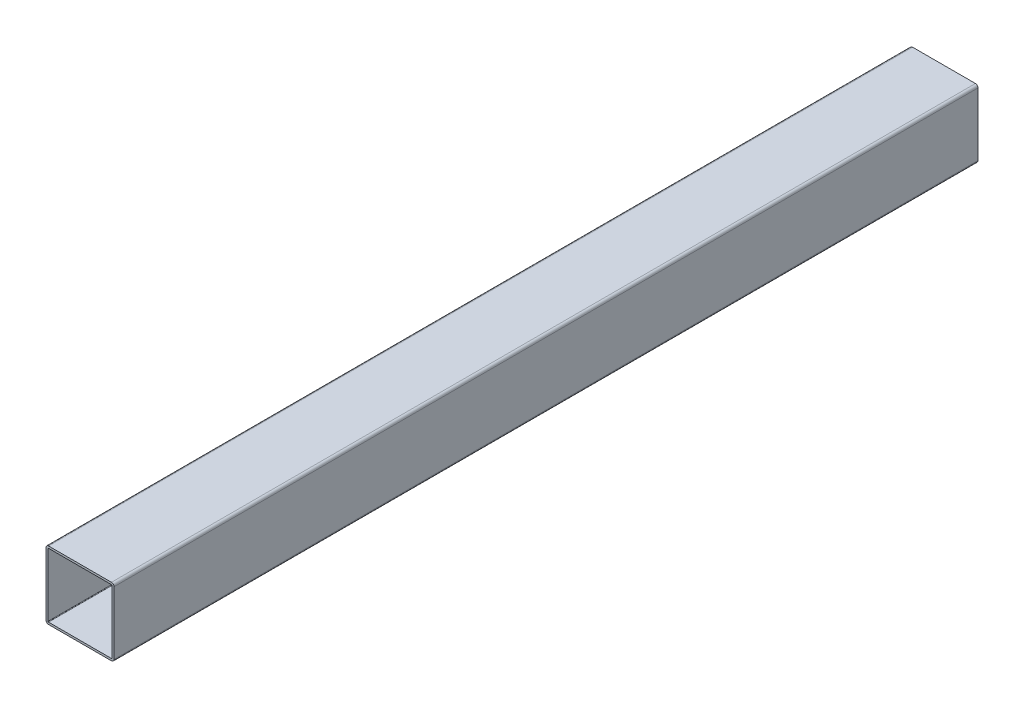
ISO-10303-21;
HEADER;
FILE_DESCRIPTION(('STEP AP214'),'2;1');
FILE_NAME('part.step','',(''),(''),'','','');
FILE_SCHEMA(('AUTOMOTIVE_DESIGN { 1 0 10303 214 1 1 1 1 }'));
ENDSEC;
DATA;
#1=APPLICATION_CONTEXT('core data for automotive mechanical design processes');
#2=APPLICATION_PROTOCOL_DEFINITION('international standard','automotive_design',2000,#1);
#3=PRODUCT_CONTEXT('',#1,'mechanical');
#4=PRODUCT('Part','Part','',(#3));
#5=PRODUCT_RELATED_PRODUCT_CATEGORY('part','',(#4));
#6=PRODUCT_DEFINITION_FORMATION('','',#4);
#7=PRODUCT_DEFINITION_CONTEXT('part definition',#1,'design');
#8=PRODUCT_DEFINITION('design','',#6,#7);
#9=PRODUCT_DEFINITION_SHAPE('','',#8);
#10=(LENGTH_UNIT() NAMED_UNIT(*) SI_UNIT(.MILLI.,.METRE.));
#11=(NAMED_UNIT(*) PLANE_ANGLE_UNIT() SI_UNIT($,.RADIAN.));
#12=(NAMED_UNIT(*) SI_UNIT($,.STERADIAN.) SOLID_ANGLE_UNIT());
#13=UNCERTAINTY_MEASURE_WITH_UNIT(LENGTH_MEASURE(1.E-05),#10,'distance_accuracy_value','');
#14=(GEOMETRIC_REPRESENTATION_CONTEXT(3) GLOBAL_UNCERTAINTY_ASSIGNED_CONTEXT((#13)) GLOBAL_UNIT_ASSIGNED_CONTEXT((#10,
#11,#12)) REPRESENTATION_CONTEXT('',''));
#15=CARTESIAN_POINT('',(0.,0.,0.));
#16=DIRECTION('',(0.,0.,1.));
#17=DIRECTION('',(1.,0.,0.));
#18=AXIS2_PLACEMENT_3D('',#15,#16,#17);
#19=CARTESIAN_POINT('',(-18.5,18.5,-508.));
#20=DIRECTION('',(0.,0.,1.));
#21=DIRECTION('',(1.,0.,0.));
#22=AXIS2_PLACEMENT_3D('',#19,#20,#21);
#23=CYLINDRICAL_SURFACE('',#22,1.5);
#24=CARTESIAN_POINT('',(-18.5,18.5,0.));
#25=DIRECTION('',(0.,0.,-1.));
#26=DIRECTION('',(-1.,0.,0.));
#27=AXIS2_PLACEMENT_3D('',#24,#25,#26);
#28=CIRCLE('',#27,1.5);
#29=CARTESIAN_POINT('',(-20.,18.5,0.));
#30=VERTEX_POINT('',#29);
#31=CARTESIAN_POINT('',(-18.5,20.,0.));
#32=VERTEX_POINT('',#31);
#33=EDGE_CURVE('E233',#30,#32,#28,.T.);
#34=ORIENTED_EDGE('',*,*,#33,.T.);
#35=DIRECTION('',(0.,0.,1.));
#36=VECTOR('',#35,1.);
#37=CARTESIAN_POINT('',(-18.5,20.,-508.));
#38=LINE('',#37,#36);
#39=CARTESIAN_POINT('',(-18.5,20.,-508.));
#40=VERTEX_POINT('',#39);
#41=EDGE_CURVE('E12',#40,#32,#38,.T.);
#42=ORIENTED_EDGE('',*,*,#41,.F.);
#43=CARTESIAN_POINT('',(-18.5,18.5,-508.));
#44=DIRECTION('',(0.,0.,-1.));
#45=DIRECTION('',(-1.,0.,0.));
#46=AXIS2_PLACEMENT_3D('',#43,#44,#45);
#47=CIRCLE('',#46,1.5);
#48=CARTESIAN_POINT('',(-20.,18.5,-508.));
#49=VERTEX_POINT('',#48);
#50=EDGE_CURVE('E311',#49,#40,#47,.T.);
#51=ORIENTED_EDGE('',*,*,#50,.F.);
#52=DIRECTION('',(0.,0.,1.));
#53=VECTOR('',#52,1.);
#54=CARTESIAN_POINT('',(-20.,18.5,-508.));
#55=LINE('',#54,#53);
#56=EDGE_CURVE('E248',#49,#30,#55,.T.);
#57=ORIENTED_EDGE('',*,*,#56,.T.);
#58=EDGE_LOOP('',(#34,#42,#51,#57));
#59=FACE_BOUND('',#58,.T.);
#60=ADVANCED_FACE('F61',(#59),#23,.T.);
#61=CARTESIAN_POINT('',(-18.5,20.,-508.));
#62=DIRECTION('',(0.,-1.,0.));
#63=DIRECTION('',(0.,0.,-1.));
#64=AXIS2_PLACEMENT_3D('',#61,#62,#63);
#65=PLANE('',#64);
#66=DIRECTION('',(1.,0.,0.));
#67=VECTOR('',#66,1.);
#68=CARTESIAN_POINT('',(-18.5,20.,0.));
#69=LINE('',#68,#67);
#70=CARTESIAN_POINT('',(18.5,20.,0.));
#71=VERTEX_POINT('',#70);
#72=EDGE_CURVE('E236',#32,#71,#69,.T.);
#73=ORIENTED_EDGE('',*,*,#72,.T.);
#74=DIRECTION('',(0.,0.,1.));
#75=VECTOR('',#74,1.);
#76=CARTESIAN_POINT('',(18.5,20.,-508.));
#77=LINE('',#76,#75);
#78=CARTESIAN_POINT('',(18.5,20.,-508.));
#79=VERTEX_POINT('',#78);
#80=EDGE_CURVE('E71',#79,#71,#77,.T.);
#81=ORIENTED_EDGE('',*,*,#80,.F.);
#82=DIRECTION('',(1.,0.,0.));
#83=VECTOR('',#82,1.);
#84=CARTESIAN_POINT('',(-18.5,20.,-508.));
#85=LINE('',#84,#83);
#86=EDGE_CURVE('E313',#40,#79,#85,.T.);
#87=ORIENTED_EDGE('',*,*,#86,.F.);
#88=ORIENTED_EDGE('',*,*,#41,.T.);
#89=EDGE_LOOP('',(#73,#81,#87,#88));
#90=FACE_BOUND('',#89,.T.);
#91=ADVANCED_FACE('F348',(#90),#65,.F.);
#92=CARTESIAN_POINT('',(18.5,18.5,-508.));
#93=DIRECTION('',(0.,0.,1.));
#94=DIRECTION('',(1.,0.,0.));
#95=AXIS2_PLACEMENT_3D('',#92,#93,#94);
#96=CYLINDRICAL_SURFACE('',#95,1.5);
#97=CARTESIAN_POINT('',(18.5,18.5,0.));
#98=DIRECTION('',(0.,0.,-1.));
#99=DIRECTION('',(-1.,0.,0.));
#100=AXIS2_PLACEMENT_3D('',#97,#98,#99);
#101=CIRCLE('',#100,1.5);
#102=CARTESIAN_POINT('',(20.,18.5,0.));
#103=VERTEX_POINT('',#102);
#104=EDGE_CURVE('E238',#71,#103,#101,.T.);
#105=ORIENTED_EDGE('',*,*,#104,.T.);
#106=DIRECTION('',(0.,0.,1.));
#107=VECTOR('',#106,1.);
#108=CARTESIAN_POINT('',(20.,18.5,-508.));
#109=LINE('',#108,#107);
#110=CARTESIAN_POINT('',(20.,18.5,-508.));
#111=VERTEX_POINT('',#110);
#112=EDGE_CURVE('E255',#111,#103,#109,.T.);
#113=ORIENTED_EDGE('',*,*,#112,.F.);
#114=CARTESIAN_POINT('',(18.5,18.5,-508.));
#115=DIRECTION('',(0.,0.,-1.));
#116=DIRECTION('',(-1.,0.,0.));
#117=AXIS2_PLACEMENT_3D('',#114,#115,#116);
#118=CIRCLE('',#117,1.5);
#119=EDGE_CURVE('E315',#79,#111,#118,.T.);
#120=ORIENTED_EDGE('',*,*,#119,.F.);
#121=ORIENTED_EDGE('',*,*,#80,.T.);
#122=EDGE_LOOP('',(#105,#113,#120,#121));
#123=FACE_BOUND('',#122,.T.);
#124=ADVANCED_FACE('F353',(#123),#96,.T.);
#125=CARTESIAN_POINT('',(20.,-18.5,-508.));
#126=DIRECTION('',(-1.,0.,0.));
#127=DIRECTION('',(0.,0.,1.));
#128=AXIS2_PLACEMENT_3D('',#125,#126,#127);
#129=PLANE('',#128);
#130=DIRECTION('',(0.,-1.,0.));
#131=VECTOR('',#130,1.);
#132=CARTESIAN_POINT('',(20.,-18.5,0.));
#133=LINE('',#132,#131);
#134=CARTESIAN_POINT('',(20.,-18.5,0.));
#135=VERTEX_POINT('',#134);
#136=EDGE_CURVE('E240',#103,#135,#133,.T.);
#137=ORIENTED_EDGE('',*,*,#136,.T.);
#138=DIRECTION('',(0.,0.,1.));
#139=VECTOR('',#138,1.);
#140=CARTESIAN_POINT('',(20.,-18.5,-508.));
#141=LINE('',#140,#139);
#142=CARTESIAN_POINT('',(20.,-18.5,-508.));
#143=VERTEX_POINT('',#142);
#144=EDGE_CURVE('E252',#143,#135,#141,.T.);
#145=ORIENTED_EDGE('',*,*,#144,.F.);
#146=DIRECTION('',(0.,-1.,0.));
#147=VECTOR('',#146,1.);
#148=CARTESIAN_POINT('',(20.,-18.5,-508.));
#149=LINE('',#148,#147);
#150=EDGE_CURVE('E317',#111,#143,#149,.T.);
#151=ORIENTED_EDGE('',*,*,#150,.F.);
#152=ORIENTED_EDGE('',*,*,#112,.T.);
#153=EDGE_LOOP('',(#137,#145,#151,#152));
#154=FACE_BOUND('',#153,.T.);
#155=ADVANCED_FACE('F323',(#154),#129,.F.);
#156=CARTESIAN_POINT('',(18.5,-18.5,-508.));
#157=DIRECTION('',(0.,0.,1.));
#158=DIRECTION('',(1.,0.,0.));
#159=AXIS2_PLACEMENT_3D('',#156,#157,#158);
#160=CYLINDRICAL_SURFACE('',#159,1.5);
#161=CARTESIAN_POINT('',(18.5,-18.5,0.));
#162=DIRECTION('',(0.,0.,-1.));
#163=DIRECTION('',(-1.,0.,0.));
#164=AXIS2_PLACEMENT_3D('',#161,#162,#163);
#165=CIRCLE('',#164,1.5);
#166=CARTESIAN_POINT('',(18.5,-20.,0.));
#167=VERTEX_POINT('',#166);
#168=EDGE_CURVE('E242',#135,#167,#165,.T.);
#169=ORIENTED_EDGE('',*,*,#168,.T.);
#170=DIRECTION('',(0.,0.,1.));
#171=VECTOR('',#170,1.);
#172=CARTESIAN_POINT('',(18.5,-20.,-508.));
#173=LINE('',#172,#171);
#174=CARTESIAN_POINT('',(18.5,-20.,-508.));
#175=VERTEX_POINT('',#174);
#176=EDGE_CURVE('E200',#175,#167,#173,.T.);
#177=ORIENTED_EDGE('',*,*,#176,.F.);
#178=CARTESIAN_POINT('',(18.5,-18.5,-508.));
#179=DIRECTION('',(0.,0.,-1.));
#180=DIRECTION('',(-1.,0.,0.));
#181=AXIS2_PLACEMENT_3D('',#178,#179,#180);
#182=CIRCLE('',#181,1.5);
#183=EDGE_CURVE('E191',#143,#175,#182,.T.);
#184=ORIENTED_EDGE('',*,*,#183,.F.);
#185=ORIENTED_EDGE('',*,*,#144,.T.);
#186=EDGE_LOOP('',(#169,#177,#184,#185));
#187=FACE_BOUND('',#186,.T.);
#188=ADVANCED_FACE('F327',(#187),#160,.T.);
#189=CARTESIAN_POINT('',(18.5,-20.,-508.));
#190=DIRECTION('',(0.,1.,0.));
#191=DIRECTION('',(0.,0.,1.));
#192=AXIS2_PLACEMENT_3D('',#189,#190,#191);
#193=PLANE('',#192);
#194=DIRECTION('',(-1.,0.,0.));
#195=VECTOR('',#194,1.);
#196=CARTESIAN_POINT('',(18.5,-20.,0.));
#197=LINE('',#196,#195);
#198=CARTESIAN_POINT('',(-18.5,-20.,0.));
#199=VERTEX_POINT('',#198);
#200=EDGE_CURVE('E199',#167,#199,#197,.T.);
#201=ORIENTED_EDGE('',*,*,#200,.T.);
#202=DIRECTION('',(0.,0.,1.));
#203=VECTOR('',#202,1.);
#204=CARTESIAN_POINT('',(-18.5,-20.,-508.));
#205=LINE('',#204,#203);
#206=CARTESIAN_POINT('',(-18.5,-20.,-508.));
#207=VERTEX_POINT('',#206);
#208=EDGE_CURVE('E196',#207,#199,#205,.T.);
#209=ORIENTED_EDGE('',*,*,#208,.F.);
#210=DIRECTION('',(-1.,0.,0.));
#211=VECTOR('',#210,1.);
#212=CARTESIAN_POINT('',(18.5,-20.,-508.));
#213=LINE('',#212,#211);
#214=EDGE_CURVE('E185',#175,#207,#213,.T.);
#215=ORIENTED_EDGE('',*,*,#214,.F.);
#216=ORIENTED_EDGE('',*,*,#176,.T.);
#217=EDGE_LOOP('',(#201,#209,#215,#216));
#218=FACE_BOUND('',#217,.T.);
#219=ADVANCED_FACE('F197',(#218),#193,.F.);
#220=CARTESIAN_POINT('',(-18.5,-18.5,-508.));
#221=DIRECTION('',(0.,0.,1.));
#222=DIRECTION('',(1.,0.,0.));
#223=AXIS2_PLACEMENT_3D('',#220,#221,#222);
#224=CYLINDRICAL_SURFACE('',#223,1.5);
#225=CARTESIAN_POINT('',(-18.5,-18.5,0.));
#226=DIRECTION('',(0.,0.,-1.));
#227=DIRECTION('',(-1.,0.,0.));
#228=AXIS2_PLACEMENT_3D('',#225,#226,#227);
#229=CIRCLE('',#228,1.5);
#230=CARTESIAN_POINT('',(-20.,-18.5,0.));
#231=VERTEX_POINT('',#230);
#232=EDGE_CURVE('E133',#199,#231,#229,.T.);
#233=ORIENTED_EDGE('',*,*,#232,.T.);
#234=DIRECTION('',(0.,0.,1.));
#235=VECTOR('',#234,1.);
#236=CARTESIAN_POINT('',(-20.,-18.5,-508.));
#237=LINE('',#236,#235);
#238=CARTESIAN_POINT('',(-20.,-18.5,-508.));
#239=VERTEX_POINT('',#238);
#240=EDGE_CURVE('E201',#239,#231,#237,.T.);
#241=ORIENTED_EDGE('',*,*,#240,.F.);
#242=CARTESIAN_POINT('',(-18.5,-18.5,-508.));
#243=DIRECTION('',(0.,0.,-1.));
#244=DIRECTION('',(-1.,0.,0.));
#245=AXIS2_PLACEMENT_3D('',#242,#243,#244);
#246=CIRCLE('',#245,1.5);
#247=EDGE_CURVE('E189',#207,#239,#246,.T.);
#248=ORIENTED_EDGE('',*,*,#247,.F.);
#249=ORIENTED_EDGE('',*,*,#208,.T.);
#250=EDGE_LOOP('',(#233,#241,#248,#249));
#251=FACE_BOUND('',#250,.T.);
#252=ADVANCED_FACE('F203',(#251),#224,.T.);
#253=CARTESIAN_POINT('',(18.5,18.5,-508.));
#254=DIRECTION('',(0.,0.,1.));
#255=DIRECTION('',(1.,0.,0.));
#256=AXIS2_PLACEMENT_3D('',#253,#254,#255);
#257=CYLINDRICAL_SURFACE('',#256,0.3);
#258=CARTESIAN_POINT('',(18.5,18.5,0.));
#259=DIRECTION('',(0.,0.,-1.));
#260=DIRECTION('',(-1.,0.,0.));
#261=AXIS2_PLACEMENT_3D('',#258,#259,#260);
#262=CIRCLE('',#261,0.3);
#263=CARTESIAN_POINT('',(18.5,18.8,0.));
#264=VERTEX_POINT('',#263);
#265=CARTESIAN_POINT('',(18.8,18.5,0.));
#266=VERTEX_POINT('',#265);
#267=EDGE_CURVE('E209',#264,#266,#262,.T.);
#268=ORIENTED_EDGE('',*,*,#267,.F.);
#269=DIRECTION('',(0.,0.,1.));
#270=VECTOR('',#269,1.);
#271=CARTESIAN_POINT('',(18.5,18.8,-508.));
#272=LINE('',#271,#270);
#273=CARTESIAN_POINT('',(18.5,18.8,-508.));
#274=VERTEX_POINT('',#273);
#275=EDGE_CURVE('E65',#274,#264,#272,.T.);
#276=ORIENTED_EDGE('',*,*,#275,.F.);
#277=CARTESIAN_POINT('',(18.5,18.5,-508.));
#278=DIRECTION('',(0.,0.,-1.));
#279=DIRECTION('',(-1.,0.,0.));
#280=AXIS2_PLACEMENT_3D('',#277,#278,#279);
#281=CIRCLE('',#280,0.3);
#282=CARTESIAN_POINT('',(18.8,18.5,-508.));
#283=VERTEX_POINT('',#282);
#284=EDGE_CURVE('E247',#274,#283,#281,.T.);
#285=ORIENTED_EDGE('',*,*,#284,.T.);
#286=DIRECTION('',(0.,0.,1.));
#287=VECTOR('',#286,1.);
#288=CARTESIAN_POINT('',(18.8,18.5,-508.));
#289=LINE('',#288,#287);
#290=EDGE_CURVE('E205',#283,#266,#289,.T.);
#291=ORIENTED_EDGE('',*,*,#290,.T.);
#292=EDGE_LOOP('',(#268,#276,#285,#291));
#293=FACE_BOUND('',#292,.T.);
#294=ADVANCED_FACE('F63',(#293),#257,.F.);
#295=CARTESIAN_POINT('',(-18.5,18.8,-508.));
#296=DIRECTION('',(0.,-1.,0.));
#297=DIRECTION('',(0.,0.,-1.));
#298=AXIS2_PLACEMENT_3D('',#295,#296,#297);
#299=PLANE('',#298);
#300=DIRECTION('',(1.,0.,0.));
#301=VECTOR('',#300,1.);
#302=CARTESIAN_POINT('',(-18.5,18.8,0.));
#303=LINE('',#302,#301);
#304=CARTESIAN_POINT('',(-18.5,18.8,0.));
#305=VERTEX_POINT('',#304);
#306=EDGE_CURVE('E212',#305,#264,#303,.T.);
#307=ORIENTED_EDGE('',*,*,#306,.F.);
#308=DIRECTION('',(0.,0.,1.));
#309=VECTOR('',#308,1.);
#310=CARTESIAN_POINT('',(-18.5,18.8,-508.));
#311=LINE('',#310,#309);
#312=CARTESIAN_POINT('',(-18.5,18.8,-508.));
#313=VERTEX_POINT('',#312);
#314=EDGE_CURVE('E270',#313,#305,#311,.T.);
#315=ORIENTED_EDGE('',*,*,#314,.F.);
#316=DIRECTION('',(1.,0.,0.));
#317=VECTOR('',#316,1.);
#318=CARTESIAN_POINT('',(-18.5,18.8,-508.));
#319=LINE('',#318,#317);
#320=EDGE_CURVE('E279',#313,#274,#319,.T.);
#321=ORIENTED_EDGE('',*,*,#320,.T.);
#322=ORIENTED_EDGE('',*,*,#275,.T.);
#323=EDGE_LOOP('',(#307,#315,#321,#322));
#324=FACE_BOUND('',#323,.T.);
#325=ADVANCED_FACE('F277',(#324),#299,.T.);
#326=CARTESIAN_POINT('',(-18.5,18.5,-508.));
#327=DIRECTION('',(0.,0.,1.));
#328=DIRECTION('',(1.,0.,0.));
#329=AXIS2_PLACEMENT_3D('',#326,#327,#328);
#330=CYLINDRICAL_SURFACE('',#329,0.3);
#331=CARTESIAN_POINT('',(-18.5,18.5,0.));
#332=DIRECTION('',(0.,0.,-1.));
#333=DIRECTION('',(-1.,0.,0.));
#334=AXIS2_PLACEMENT_3D('',#331,#332,#333);
#335=CIRCLE('',#334,0.3);
#336=CARTESIAN_POINT('',(-18.8,18.5,0.));
#337=VERTEX_POINT('',#336);
#338=EDGE_CURVE('E215',#337,#305,#335,.T.);
#339=ORIENTED_EDGE('',*,*,#338,.F.);
#340=DIRECTION('',(0.,0.,1.));
#341=VECTOR('',#340,1.);
#342=CARTESIAN_POINT('',(-18.8,18.5,-508.));
#343=LINE('',#342,#341);
#344=CARTESIAN_POINT('',(-18.8,18.5,-508.));
#345=VERTEX_POINT('',#344);
#346=EDGE_CURVE('E269',#345,#337,#343,.T.);
#347=ORIENTED_EDGE('',*,*,#346,.F.);
#348=CARTESIAN_POINT('',(-18.5,18.5,-508.));
#349=DIRECTION('',(0.,0.,-1.));
#350=DIRECTION('',(-1.,0.,0.));
#351=AXIS2_PLACEMENT_3D('',#348,#349,#350);
#352=CIRCLE('',#351,0.3);
#353=EDGE_CURVE('E287',#345,#313,#352,.T.);
#354=ORIENTED_EDGE('',*,*,#353,.T.);
#355=ORIENTED_EDGE('',*,*,#314,.T.);
#356=EDGE_LOOP('',(#339,#347,#354,#355));
#357=FACE_BOUND('',#356,.T.);
#358=ADVANCED_FACE('F285',(#357),#330,.F.);
#359=CARTESIAN_POINT('',(-18.8,18.5,-508.));
#360=DIRECTION('',(1.,0.,0.));
#361=DIRECTION('',(0.,0.,-1.));
#362=AXIS2_PLACEMENT_3D('',#359,#360,#361);
#363=PLANE('',#362);
#364=DIRECTION('',(0.,1.,0.));
#365=VECTOR('',#364,1.);
#366=CARTESIAN_POINT('',(-18.8,18.5,0.));
#367=LINE('',#366,#365);
#368=CARTESIAN_POINT('',(-18.8,-18.5,0.));
#369=VERTEX_POINT('',#368);
#370=EDGE_CURVE('E218',#369,#337,#367,.T.);
#371=ORIENTED_EDGE('',*,*,#370,.F.);
#372=DIRECTION('',(0.,0.,1.));
#373=VECTOR('',#372,1.);
#374=CARTESIAN_POINT('',(-18.8,-18.5,-508.));
#375=LINE('',#374,#373);
#376=CARTESIAN_POINT('',(-18.8,-18.5,-508.));
#377=VERTEX_POINT('',#376);
#378=EDGE_CURVE('E267',#377,#369,#375,.T.);
#379=ORIENTED_EDGE('',*,*,#378,.F.);
#380=DIRECTION('',(0.,1.,0.));
#381=VECTOR('',#380,1.);
#382=CARTESIAN_POINT('',(-18.8,18.5,-508.));
#383=LINE('',#382,#381);
#384=EDGE_CURVE('E293',#377,#345,#383,.T.);
#385=ORIENTED_EDGE('',*,*,#384,.T.);
#386=ORIENTED_EDGE('',*,*,#346,.T.);
#387=EDGE_LOOP('',(#371,#379,#385,#386));
#388=FACE_BOUND('',#387,.T.);
#389=ADVANCED_FACE('F296',(#388),#363,.T.);
#390=CARTESIAN_POINT('',(-18.5,-18.5,-508.));
#391=DIRECTION('',(0.,0.,1.));
#392=DIRECTION('',(1.,0.,0.));
#393=AXIS2_PLACEMENT_3D('',#390,#391,#392);
#394=CYLINDRICAL_SURFACE('',#393,0.300000000000005);
#395=CARTESIAN_POINT('',(-18.5,-18.5,0.));
#396=DIRECTION('',(0.,0.,-1.));
#397=DIRECTION('',(-1.,0.,0.));
#398=AXIS2_PLACEMENT_3D('',#395,#396,#397);
#399=CIRCLE('',#398,0.300000000000005);
#400=CARTESIAN_POINT('',(-18.5,-18.8,0.));
#401=VERTEX_POINT('',#400);
#402=EDGE_CURVE('E221',#401,#369,#399,.T.);
#403=ORIENTED_EDGE('',*,*,#402,.F.);
#404=DIRECTION('',(0.,0.,1.));
#405=VECTOR('',#404,1.);
#406=CARTESIAN_POINT('',(-18.5,-18.8,-508.));
#407=LINE('',#406,#405);
#408=CARTESIAN_POINT('',(-18.5,-18.8,-508.));
#409=VERTEX_POINT('',#408);
#410=EDGE_CURVE('E265',#409,#401,#407,.T.);
#411=ORIENTED_EDGE('',*,*,#410,.F.);
#412=CARTESIAN_POINT('',(-18.5,-18.5,-508.));
#413=DIRECTION('',(0.,0.,-1.));
#414=DIRECTION('',(-1.,0.,0.));
#415=AXIS2_PLACEMENT_3D('',#412,#413,#414);
#416=CIRCLE('',#415,0.300000000000005);
#417=EDGE_CURVE('E297',#409,#377,#416,.T.);
#418=ORIENTED_EDGE('',*,*,#417,.T.);
#419=ORIENTED_EDGE('',*,*,#378,.T.);
#420=EDGE_LOOP('',(#403,#411,#418,#419));
#421=FACE_BOUND('',#420,.T.);
#422=ADVANCED_FACE('F364',(#421),#394,.F.);
#423=CARTESIAN_POINT('',(18.5,-18.8,-508.));
#424=DIRECTION('',(0.,1.,0.));
#425=DIRECTION('',(0.,0.,1.));
#426=AXIS2_PLACEMENT_3D('',#423,#424,#425);
#427=PLANE('',#426);
#428=DIRECTION('',(-1.,0.,0.));
#429=VECTOR('',#428,1.);
#430=CARTESIAN_POINT('',(18.5,-18.8,0.));
#431=LINE('',#430,#429);
#432=CARTESIAN_POINT('',(18.5,-18.8,0.));
#433=VERTEX_POINT('',#432);
#434=EDGE_CURVE('E224',#433,#401,#431,.T.);
#435=ORIENTED_EDGE('',*,*,#434,.F.);
#436=DIRECTION('',(0.,0.,1.));
#437=VECTOR('',#436,1.);
#438=CARTESIAN_POINT('',(18.5,-18.8,-508.));
#439=LINE('',#438,#437);
#440=CARTESIAN_POINT('',(18.5,-18.8,-508.));
#441=VERTEX_POINT('',#440);
#442=EDGE_CURVE('E263',#441,#433,#439,.T.);
#443=ORIENTED_EDGE('',*,*,#442,.F.);
#444=DIRECTION('',(-1.,0.,0.));
#445=VECTOR('',#444,1.);
#446=CARTESIAN_POINT('',(18.5,-18.8,-508.));
#447=LINE('',#446,#445);
#448=EDGE_CURVE('E299',#441,#409,#447,.T.);
#449=ORIENTED_EDGE('',*,*,#448,.T.);
#450=ORIENTED_EDGE('',*,*,#410,.T.);
#451=EDGE_LOOP('',(#435,#443,#449,#450));
#452=FACE_BOUND('',#451,.T.);
#453=ADVANCED_FACE('F360',(#452),#427,.T.);
#454=CARTESIAN_POINT('',(18.5,-18.5,-508.));
#455=DIRECTION('',(0.,0.,1.));
#456=DIRECTION('',(1.,0.,0.));
#457=AXIS2_PLACEMENT_3D('',#454,#455,#456);
#458=CYLINDRICAL_SURFACE('',#457,0.300000000000003);
#459=CARTESIAN_POINT('',(18.5,-18.5,0.));
#460=DIRECTION('',(0.,0.,-1.));
#461=DIRECTION('',(-1.,0.,0.));
#462=AXIS2_PLACEMENT_3D('',#459,#460,#461);
#463=CIRCLE('',#462,0.300000000000003);
#464=CARTESIAN_POINT('',(18.8,-18.5,0.));
#465=VERTEX_POINT('',#464);
#466=EDGE_CURVE('E227',#465,#433,#463,.T.);
#467=ORIENTED_EDGE('',*,*,#466,.F.);
#468=DIRECTION('',(0.,0.,1.));
#469=VECTOR('',#468,1.);
#470=CARTESIAN_POINT('',(18.8,-18.5,-508.));
#471=LINE('',#470,#469);
#472=CARTESIAN_POINT('',(18.8,-18.5,-508.));
#473=VERTEX_POINT('',#472);
#474=EDGE_CURVE('E261',#473,#465,#471,.T.);
#475=ORIENTED_EDGE('',*,*,#474,.F.);
#476=CARTESIAN_POINT('',(18.5,-18.5,-508.));
#477=DIRECTION('',(0.,0.,-1.));
#478=DIRECTION('',(-1.,0.,0.));
#479=AXIS2_PLACEMENT_3D('',#476,#477,#478);
#480=CIRCLE('',#479,0.300000000000003);
#481=EDGE_CURVE('E305',#473,#441,#480,.T.);
#482=ORIENTED_EDGE('',*,*,#481,.T.);
#483=ORIENTED_EDGE('',*,*,#442,.T.);
#484=EDGE_LOOP('',(#467,#475,#482,#483));
#485=FACE_BOUND('',#484,.T.);
#486=ADVANCED_FACE('F342',(#485),#458,.F.);
#487=CARTESIAN_POINT('',(18.8,-18.5,-508.));
#488=DIRECTION('',(-1.,0.,0.));
#489=DIRECTION('',(0.,0.,1.));
#490=AXIS2_PLACEMENT_3D('',#487,#488,#489);
#491=PLANE('',#490);
#492=DIRECTION('',(0.,-1.,0.));
#493=VECTOR('',#492,1.);
#494=CARTESIAN_POINT('',(18.8,-18.5,0.));
#495=LINE('',#494,#493);
#496=EDGE_CURVE('E230',#266,#465,#495,.T.);
#497=ORIENTED_EDGE('',*,*,#496,.F.);
#498=ORIENTED_EDGE('',*,*,#290,.F.);
#499=DIRECTION('',(0.,-1.,0.));
#500=VECTOR('',#499,1.);
#501=CARTESIAN_POINT('',(18.8,-18.5,-508.));
#502=LINE('',#501,#500);
#503=EDGE_CURVE('E308',#283,#473,#502,.T.);
#504=ORIENTED_EDGE('',*,*,#503,.T.);
#505=ORIENTED_EDGE('',*,*,#474,.T.);
#506=EDGE_LOOP('',(#497,#498,#504,#505));
#507=FACE_BOUND('',#506,.T.);
#508=ADVANCED_FACE('F335',(#507),#491,.T.);
#509=CARTESIAN_POINT('',(-20.,18.5,-508.));
#510=DIRECTION('',(1.,0.,0.));
#511=DIRECTION('',(0.,0.,-1.));
#512=AXIS2_PLACEMENT_3D('',#509,#510,#511);
#513=PLANE('',#512);
#514=DIRECTION('',(0.,1.,0.));
#515=VECTOR('',#514,1.);
#516=CARTESIAN_POINT('',(-20.,18.5,0.));
#517=LINE('',#516,#515);
#518=EDGE_CURVE('E139',#231,#30,#517,.T.);
#519=ORIENTED_EDGE('',*,*,#518,.T.);
#520=ORIENTED_EDGE('',*,*,#56,.F.);
#521=DIRECTION('',(0.,1.,0.));
#522=VECTOR('',#521,1.);
#523=CARTESIAN_POINT('',(-20.,18.5,-508.));
#524=LINE('',#523,#522);
#525=EDGE_CURVE('E80',#239,#49,#524,.T.);
#526=ORIENTED_EDGE('',*,*,#525,.F.);
#527=ORIENTED_EDGE('',*,*,#240,.T.);
#528=EDGE_LOOP('',(#519,#520,#526,#527));
#529=FACE_BOUND('',#528,.T.);
#530=ADVANCED_FACE('F333',(#529),#513,.F.);
#531=CARTESIAN_POINT('',(-18.5,18.5,-508.));
#532=DIRECTION('',(0.,0.,-1.));
#533=DIRECTION('',(-1.,0.,0.));
#534=AXIS2_PLACEMENT_3D('',#531,#532,#533);
#535=PLANE('',#534);
#536=ORIENTED_EDGE('',*,*,#284,.F.);
#537=ORIENTED_EDGE('',*,*,#320,.F.);
#538=ORIENTED_EDGE('',*,*,#353,.F.);
#539=ORIENTED_EDGE('',*,*,#384,.F.);
#540=ORIENTED_EDGE('',*,*,#417,.F.);
#541=ORIENTED_EDGE('',*,*,#448,.F.);
#542=ORIENTED_EDGE('',*,*,#481,.F.);
#543=ORIENTED_EDGE('',*,*,#503,.F.);
#544=EDGE_LOOP('',(#536,#537,#538,#539,#540,#541,#542,#543));
#545=FACE_BOUND('',#544,.T.);
#546=ORIENTED_EDGE('',*,*,#50,.T.);
#547=ORIENTED_EDGE('',*,*,#86,.T.);
#548=ORIENTED_EDGE('',*,*,#119,.T.);
#549=ORIENTED_EDGE('',*,*,#150,.T.);
#550=ORIENTED_EDGE('',*,*,#183,.T.);
#551=ORIENTED_EDGE('',*,*,#214,.T.);
#552=ORIENTED_EDGE('',*,*,#247,.T.);
#553=ORIENTED_EDGE('',*,*,#525,.T.);
#554=EDGE_LOOP('',(#546,#547,#548,#549,#550,#551,#552,#553));
#555=FACE_BOUND('',#554,.T.);
#556=ADVANCED_FACE('F187',(#545,#555),#535,.T.);
#557=CARTESIAN_POINT('',(-18.5,18.5,0.));
#558=DIRECTION('',(0.,0.,-1.));
#559=DIRECTION('',(-1.,0.,0.));
#560=AXIS2_PLACEMENT_3D('',#557,#558,#559);
#561=PLANE('',#560);
#562=ORIENTED_EDGE('',*,*,#267,.T.);
#563=ORIENTED_EDGE('',*,*,#496,.T.);
#564=ORIENTED_EDGE('',*,*,#466,.T.);
#565=ORIENTED_EDGE('',*,*,#434,.T.);
#566=ORIENTED_EDGE('',*,*,#402,.T.);
#567=ORIENTED_EDGE('',*,*,#370,.T.);
#568=ORIENTED_EDGE('',*,*,#338,.T.);
#569=ORIENTED_EDGE('',*,*,#306,.T.);
#570=EDGE_LOOP('',(#562,#563,#564,#565,#566,#567,#568,#569));
#571=FACE_BOUND('',#570,.T.);
#572=ORIENTED_EDGE('',*,*,#33,.F.);
#573=ORIENTED_EDGE('',*,*,#518,.F.);
#574=ORIENTED_EDGE('',*,*,#232,.F.);
#575=ORIENTED_EDGE('',*,*,#200,.F.);
#576=ORIENTED_EDGE('',*,*,#168,.F.);
#577=ORIENTED_EDGE('',*,*,#136,.F.);
#578=ORIENTED_EDGE('',*,*,#104,.F.);
#579=ORIENTED_EDGE('',*,*,#72,.F.);
#580=EDGE_LOOP('',(#572,#573,#574,#575,#576,#577,#578,#579));
#581=FACE_BOUND('',#580,.T.);
#582=ADVANCED_FACE('F282',(#571,#581),#561,.F.);
#583=CLOSED_SHELL('',(#60,#91,#124,#155,#188,#219,#252,#294,#325,#358,#389,#422,#453,#486,#508,
#530,#556,#582));
#584=MANIFOLD_SOLID_BREP('B2',#583);
#585=ADVANCED_BREP_SHAPE_REPRESENTATION('',(#18,#584),#14);
#586=SHAPE_DEFINITION_REPRESENTATION(#9,#585);
ENDSEC;
END-ISO-10303-21;
